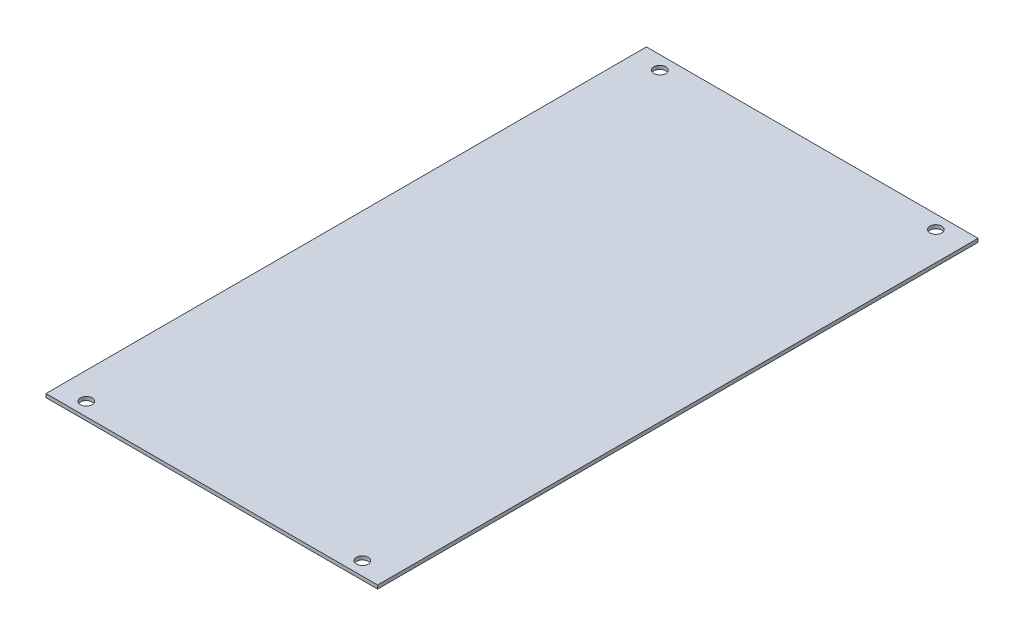
ISO-10303-21;
HEADER;
FILE_DESCRIPTION(('STEP AP214'),'2;1');
FILE_NAME('part.step','',(''),(''),'','','');
FILE_SCHEMA(('AUTOMOTIVE_DESIGN { 1 0 10303 214 1 1 1 1 }'));
ENDSEC;
DATA;
#1=APPLICATION_CONTEXT('core data for automotive mechanical design processes');
#2=APPLICATION_PROTOCOL_DEFINITION('international standard','automotive_design',2000,#1);
#3=PRODUCT_CONTEXT('',#1,'mechanical');
#4=PRODUCT('Part','Part','',(#3));
#5=PRODUCT_RELATED_PRODUCT_CATEGORY('part','',(#4));
#6=PRODUCT_DEFINITION_FORMATION('','',#4);
#7=PRODUCT_DEFINITION_CONTEXT('part definition',#1,'design');
#8=PRODUCT_DEFINITION('design','',#6,#7);
#9=PRODUCT_DEFINITION_SHAPE('','',#8);
#10=(LENGTH_UNIT() NAMED_UNIT(*) SI_UNIT(.MILLI.,.METRE.));
#11=(NAMED_UNIT(*) PLANE_ANGLE_UNIT() SI_UNIT($,.RADIAN.));
#12=(NAMED_UNIT(*) SI_UNIT($,.STERADIAN.) SOLID_ANGLE_UNIT());
#13=UNCERTAINTY_MEASURE_WITH_UNIT(LENGTH_MEASURE(1.E-05),#10,'distance_accuracy_value','');
#14=(GEOMETRIC_REPRESENTATION_CONTEXT(3) GLOBAL_UNCERTAINTY_ASSIGNED_CONTEXT((#13)) GLOBAL_UNIT_ASSIGNED_CONTEXT((#10,
#11,#12)) REPRESENTATION_CONTEXT('',''));
#15=CARTESIAN_POINT('',(0.,0.,0.));
#16=DIRECTION('',(0.,0.,1.));
#17=DIRECTION('',(1.,0.,0.));
#18=AXIS2_PLACEMENT_3D('',#15,#16,#17);
#19=CARTESIAN_POINT('',(92.4999999999999,-2.,167.5));
#20=DIRECTION('',(0.,1.,0.));
#21=DIRECTION('',(0.,0.,1.));
#22=AXIS2_PLACEMENT_3D('',#19,#20,#21);
#23=PLANE('',#22);
#24=CARTESIAN_POINT('',(76.4999999999999,-2.,160.));
#25=DIRECTION('',(0.,-1.,0.));
#26=DIRECTION('',(0.,0.,-1.));
#27=AXIS2_PLACEMENT_3D('',#24,#25,#26);
#28=CIRCLE('',#27,3.29999999999998);
#29=CARTESIAN_POINT('',(76.4999999999999,-2.,156.7));
#30=VERTEX_POINT('',#29);
#31=EDGE_CURVE('E172',#30,#30,#28,.T.);
#32=ORIENTED_EDGE('',*,*,#31,.F.);
#33=EDGE_LOOP('',(#32));
#34=FACE_BOUND('',#33,.T.);
#35=CARTESIAN_POINT('',(-77.5000000000001,-2.,-160.));
#36=DIRECTION('',(0.,-1.,0.));
#37=DIRECTION('',(0.,0.,-1.));
#38=AXIS2_PLACEMENT_3D('',#35,#36,#37);
#39=CIRCLE('',#38,3.29999999999998);
#40=CARTESIAN_POINT('',(-77.5000000000001,-2.,-163.3));
#41=VERTEX_POINT('',#40);
#42=EDGE_CURVE('E164',#41,#41,#39,.T.);
#43=ORIENTED_EDGE('',*,*,#42,.F.);
#44=EDGE_LOOP('',(#43));
#45=FACE_BOUND('',#44,.T.);
#46=CARTESIAN_POINT('',(76.4999999999999,-2.,-160.));
#47=DIRECTION('',(0.,-1.,0.));
#48=DIRECTION('',(0.,0.,-1.));
#49=AXIS2_PLACEMENT_3D('',#46,#47,#48);
#50=CIRCLE('',#49,3.29999999999998);
#51=CARTESIAN_POINT('',(76.4999999999999,-2.,-163.3));
#52=VERTEX_POINT('',#51);
#53=EDGE_CURVE('E159',#52,#52,#50,.T.);
#54=ORIENTED_EDGE('',*,*,#53,.F.);
#55=EDGE_LOOP('',(#54));
#56=FACE_BOUND('',#55,.T.);
#57=DIRECTION('',(0.,0.,-1.));
#58=VECTOR('',#57,1.);
#59=CARTESIAN_POINT('',(92.4999999999999,-2.,-167.5));
#60=LINE('',#59,#58);
#61=CARTESIAN_POINT('',(92.4999999999999,-2.,167.5));
#62=VERTEX_POINT('',#61);
#63=CARTESIAN_POINT('',(92.4999999999999,-2.,-167.5));
#64=VERTEX_POINT('',#63);
#65=EDGE_CURVE('E100',#62,#64,#60,.T.);
#66=ORIENTED_EDGE('',*,*,#65,.F.);
#67=DIRECTION('',(1.,0.,0.));
#68=VECTOR('',#67,1.);
#69=CARTESIAN_POINT('',(-92.5,-2.,167.5));
#70=LINE('',#69,#68);
#71=CARTESIAN_POINT('',(-92.5,-2.,167.5));
#72=VERTEX_POINT('',#71);
#73=EDGE_CURVE('E97',#72,#62,#70,.T.);
#74=ORIENTED_EDGE('',*,*,#73,.F.);
#75=DIRECTION('',(0.,0.,1.));
#76=VECTOR('',#75,1.);
#77=CARTESIAN_POINT('',(-92.5000000000001,-2.,-167.5));
#78=LINE('',#77,#76);
#79=CARTESIAN_POINT('',(-92.5000000000001,-2.,-167.5));
#80=VERTEX_POINT('',#79);
#81=EDGE_CURVE('E90',#80,#72,#78,.T.);
#82=ORIENTED_EDGE('',*,*,#81,.F.);
#83=DIRECTION('',(-1.,0.,0.));
#84=VECTOR('',#83,1.);
#85=CARTESIAN_POINT('',(-92.5000000000001,-2.,-167.5));
#86=LINE('',#85,#84);
#87=EDGE_CURVE('E96',#64,#80,#86,.T.);
#88=ORIENTED_EDGE('',*,*,#87,.F.);
#89=EDGE_LOOP('',(#66,#74,#82,#88));
#90=FACE_BOUND('',#89,.T.);
#91=CARTESIAN_POINT('',(-77.5000000000001,-2.,160.));
#92=DIRECTION('',(0.,-1.,0.));
#93=DIRECTION('',(0.,0.,-1.));
#94=AXIS2_PLACEMENT_3D('',#91,#92,#93);
#95=CIRCLE('',#94,3.29999999999998);
#96=CARTESIAN_POINT('',(-77.5000000000001,-2.,156.7));
#97=VERTEX_POINT('',#96);
#98=EDGE_CURVE('E168',#97,#97,#95,.T.);
#99=ORIENTED_EDGE('',*,*,#98,.F.);
#100=EDGE_LOOP('',(#99));
#101=FACE_BOUND('',#100,.T.);
#102=ADVANCED_FACE('F41',(#34,#45,#56,#90,#101),#23,.F.);
#103=CARTESIAN_POINT('',(92.4999999999999,-2.,-167.5));
#104=DIRECTION('',(1.,0.,0.));
#105=DIRECTION('',(0.,0.,-1.));
#106=AXIS2_PLACEMENT_3D('',#103,#104,#105);
#107=PLANE('',#106);
#108=DIRECTION('',(0.,0.,-1.));
#109=VECTOR('',#108,1.);
#110=CARTESIAN_POINT('',(92.4999999999999,0.,-167.5));
#111=LINE('',#110,#109);
#112=CARTESIAN_POINT('',(92.4999999999999,0.,167.5));
#113=VERTEX_POINT('',#112);
#114=CARTESIAN_POINT('',(92.4999999999999,0.,-167.5));
#115=VERTEX_POINT('',#114);
#116=EDGE_CURVE('E107',#113,#115,#111,.T.);
#117=ORIENTED_EDGE('',*,*,#116,.F.);
#118=DIRECTION('',(0.,1.,0.));
#119=VECTOR('',#118,1.);
#120=CARTESIAN_POINT('',(92.4999999999999,-2.,167.5));
#121=LINE('',#120,#119);
#122=EDGE_CURVE('E11',#62,#113,#121,.T.);
#123=ORIENTED_EDGE('',*,*,#122,.F.);
#124=ORIENTED_EDGE('',*,*,#65,.T.);
#125=DIRECTION('',(0.,1.,0.));
#126=VECTOR('',#125,1.);
#127=CARTESIAN_POINT('',(92.4999999999999,-2.,-167.5));
#128=LINE('',#127,#126);
#129=EDGE_CURVE('E45',#64,#115,#128,.T.);
#130=ORIENTED_EDGE('',*,*,#129,.T.);
#131=EDGE_LOOP('',(#117,#123,#124,#130));
#132=FACE_BOUND('',#131,.T.);
#133=ADVANCED_FACE('F43',(#132),#107,.T.);
#134=CARTESIAN_POINT('',(-92.5,-2.,167.5));
#135=DIRECTION('',(0.,0.,1.));
#136=DIRECTION('',(1.,0.,0.));
#137=AXIS2_PLACEMENT_3D('',#134,#135,#136);
#138=PLANE('',#137);
#139=DIRECTION('',(1.,0.,0.));
#140=VECTOR('',#139,1.);
#141=CARTESIAN_POINT('',(-92.5,0.,167.5));
#142=LINE('',#141,#140);
#143=CARTESIAN_POINT('',(-92.5,0.,167.5));
#144=VERTEX_POINT('',#143);
#145=EDGE_CURVE('E102',#144,#113,#142,.T.);
#146=ORIENTED_EDGE('',*,*,#145,.F.);
#147=DIRECTION('',(0.,1.,0.));
#148=VECTOR('',#147,1.);
#149=CARTESIAN_POINT('',(-92.5,-2.,167.5));
#150=LINE('',#149,#148);
#151=EDGE_CURVE('E51',#72,#144,#150,.T.);
#152=ORIENTED_EDGE('',*,*,#151,.F.);
#153=ORIENTED_EDGE('',*,*,#73,.T.);
#154=ORIENTED_EDGE('',*,*,#122,.T.);
#155=EDGE_LOOP('',(#146,#152,#153,#154));
#156=FACE_BOUND('',#155,.T.);
#157=ADVANCED_FACE('F118',(#156),#138,.T.);
#158=CARTESIAN_POINT('',(-92.5000000000001,-2.,-167.5));
#159=DIRECTION('',(-1.,0.,0.));
#160=DIRECTION('',(0.,0.,1.));
#161=AXIS2_PLACEMENT_3D('',#158,#159,#160);
#162=PLANE('',#161);
#163=DIRECTION('',(0.,0.,1.));
#164=VECTOR('',#163,1.);
#165=CARTESIAN_POINT('',(-92.5000000000001,0.,-167.5));
#166=LINE('',#165,#164);
#167=CARTESIAN_POINT('',(-92.5000000000001,0.,-167.5));
#168=VERTEX_POINT('',#167);
#169=EDGE_CURVE('E92',#168,#144,#166,.T.);
#170=ORIENTED_EDGE('',*,*,#169,.F.);
#171=DIRECTION('',(0.,1.,0.));
#172=VECTOR('',#171,1.);
#173=CARTESIAN_POINT('',(-92.5000000000001,-2.,-167.5));
#174=LINE('',#173,#172);
#175=EDGE_CURVE('E87',#80,#168,#174,.T.);
#176=ORIENTED_EDGE('',*,*,#175,.F.);
#177=ORIENTED_EDGE('',*,*,#81,.T.);
#178=ORIENTED_EDGE('',*,*,#151,.T.);
#179=EDGE_LOOP('',(#170,#176,#177,#178));
#180=FACE_BOUND('',#179,.T.);
#181=ADVANCED_FACE('F89',(#180),#162,.T.);
#182=CARTESIAN_POINT('',(-92.5000000000001,-2.,-167.5));
#183=DIRECTION('',(0.,0.,-1.));
#184=DIRECTION('',(-1.,0.,0.));
#185=AXIS2_PLACEMENT_3D('',#182,#183,#184);
#186=PLANE('',#185);
#187=DIRECTION('',(-1.,0.,0.));
#188=VECTOR('',#187,1.);
#189=CARTESIAN_POINT('',(-92.5000000000001,0.,-167.5));
#190=LINE('',#189,#188);
#191=EDGE_CURVE('E110',#115,#168,#190,.T.);
#192=ORIENTED_EDGE('',*,*,#191,.F.);
#193=ORIENTED_EDGE('',*,*,#129,.F.);
#194=ORIENTED_EDGE('',*,*,#87,.T.);
#195=ORIENTED_EDGE('',*,*,#175,.T.);
#196=EDGE_LOOP('',(#192,#193,#194,#195));
#197=FACE_BOUND('',#196,.T.);
#198=ADVANCED_FACE('F99',(#197),#186,.T.);
#199=CARTESIAN_POINT('',(92.4999999999999,0.,167.5));
#200=DIRECTION('',(0.,1.,0.));
#201=DIRECTION('',(0.,0.,1.));
#202=AXIS2_PLACEMENT_3D('',#199,#200,#201);
#203=PLANE('',#202);
#204=CARTESIAN_POINT('',(76.4999999999999,0.,160.));
#205=DIRECTION('',(0.,-1.,0.));
#206=DIRECTION('',(0.,0.,-1.));
#207=AXIS2_PLACEMENT_3D('',#204,#205,#206);
#208=CIRCLE('',#207,3.3);
#209=CARTESIAN_POINT('',(76.4999999999999,0.,156.7));
#210=VERTEX_POINT('',#209);
#211=EDGE_CURVE('E148',#210,#210,#208,.T.);
#212=ORIENTED_EDGE('',*,*,#211,.T.);
#213=EDGE_LOOP('',(#212));
#214=FACE_BOUND('',#213,.T.);
#215=CARTESIAN_POINT('',(-77.5000000000001,0.,160.));
#216=DIRECTION('',(0.,-1.,0.));
#217=DIRECTION('',(0.,0.,-1.));
#218=AXIS2_PLACEMENT_3D('',#215,#216,#217);
#219=CIRCLE('',#218,3.3);
#220=CARTESIAN_POINT('',(-77.5000000000001,0.,156.7));
#221=VERTEX_POINT('',#220);
#222=EDGE_CURVE('E152',#221,#221,#219,.T.);
#223=ORIENTED_EDGE('',*,*,#222,.T.);
#224=EDGE_LOOP('',(#223));
#225=FACE_BOUND('',#224,.T.);
#226=CARTESIAN_POINT('',(-77.5000000000001,0.,-160.));
#227=DIRECTION('',(0.,-1.,0.));
#228=DIRECTION('',(0.,0.,-1.));
#229=AXIS2_PLACEMENT_3D('',#226,#227,#228);
#230=CIRCLE('',#229,3.3);
#231=CARTESIAN_POINT('',(-77.5000000000001,0.,-163.3));
#232=VERTEX_POINT('',#231);
#233=EDGE_CURVE('E156',#232,#232,#230,.T.);
#234=ORIENTED_EDGE('',*,*,#233,.T.);
#235=EDGE_LOOP('',(#234));
#236=FACE_BOUND('',#235,.T.);
#237=CARTESIAN_POINT('',(76.4999999999999,0.,-160.));
#238=DIRECTION('',(0.,-1.,0.));
#239=DIRECTION('',(0.,0.,-1.));
#240=AXIS2_PLACEMENT_3D('',#237,#238,#239);
#241=CIRCLE('',#240,3.3);
#242=CARTESIAN_POINT('',(76.4999999999999,0.,-163.3));
#243=VERTEX_POINT('',#242);
#244=EDGE_CURVE('E111',#243,#243,#241,.T.);
#245=ORIENTED_EDGE('',*,*,#244,.T.);
#246=EDGE_LOOP('',(#245));
#247=FACE_BOUND('',#246,.T.);
#248=ORIENTED_EDGE('',*,*,#116,.T.);
#249=ORIENTED_EDGE('',*,*,#191,.T.);
#250=ORIENTED_EDGE('',*,*,#169,.T.);
#251=ORIENTED_EDGE('',*,*,#145,.T.);
#252=EDGE_LOOP('',(#248,#249,#250,#251));
#253=FACE_BOUND('',#252,.T.);
#254=ADVANCED_FACE('F117',(#214,#225,#236,#247,#253),#203,.T.);
#255=CARTESIAN_POINT('',(76.4999999999999,-2.,-160.));
#256=DIRECTION('',(0.,-1.,0.));
#257=DIRECTION('',(0.,0.,-1.));
#258=AXIS2_PLACEMENT_3D('',#255,#256,#257);
#259=CYLINDRICAL_SURFACE('',#258,3.29999999999999);
#260=ORIENTED_EDGE('',*,*,#244,.F.);
#261=EDGE_LOOP('',(#260));
#262=FACE_BOUND('',#261,.T.);
#263=ORIENTED_EDGE('',*,*,#53,.T.);
#264=EDGE_LOOP('',(#263));
#265=FACE_BOUND('',#264,.T.);
#266=ADVANCED_FACE('F135',(#262,#265),#259,.F.);
#267=CARTESIAN_POINT('',(-77.5000000000001,-2.,-160.));
#268=DIRECTION('',(0.,-1.,0.));
#269=DIRECTION('',(0.,0.,-1.));
#270=AXIS2_PLACEMENT_3D('',#267,#268,#269);
#271=CYLINDRICAL_SURFACE('',#270,3.29999999999999);
#272=ORIENTED_EDGE('',*,*,#233,.F.);
#273=EDGE_LOOP('',(#272));
#274=FACE_BOUND('',#273,.T.);
#275=ORIENTED_EDGE('',*,*,#42,.T.);
#276=EDGE_LOOP('',(#275));
#277=FACE_BOUND('',#276,.T.);
#278=ADVANCED_FACE('F143',(#274,#277),#271,.F.);
#279=CARTESIAN_POINT('',(-77.5000000000001,-2.,160.));
#280=DIRECTION('',(0.,-1.,0.));
#281=DIRECTION('',(0.,0.,-1.));
#282=AXIS2_PLACEMENT_3D('',#279,#280,#281);
#283=CYLINDRICAL_SURFACE('',#282,3.29999999999999);
#284=ORIENTED_EDGE('',*,*,#222,.F.);
#285=EDGE_LOOP('',(#284));
#286=FACE_BOUND('',#285,.T.);
#287=ORIENTED_EDGE('',*,*,#98,.T.);
#288=EDGE_LOOP('',(#287));
#289=FACE_BOUND('',#288,.T.);
#290=ADVANCED_FACE('F177',(#286,#289),#283,.F.);
#291=CARTESIAN_POINT('',(76.4999999999999,-2.,160.));
#292=DIRECTION('',(0.,-1.,0.));
#293=DIRECTION('',(0.,0.,-1.));
#294=AXIS2_PLACEMENT_3D('',#291,#292,#293);
#295=CYLINDRICAL_SURFACE('',#294,3.29999999999999);
#296=ORIENTED_EDGE('',*,*,#211,.F.);
#297=EDGE_LOOP('',(#296));
#298=FACE_BOUND('',#297,.T.);
#299=ORIENTED_EDGE('',*,*,#31,.T.);
#300=EDGE_LOOP('',(#299));
#301=FACE_BOUND('',#300,.T.);
#302=ADVANCED_FACE('F175',(#298,#301),#295,.F.);
#303=CLOSED_SHELL('',(#102,#133,#157,#181,#198,#254,#266,#278,#290,#302));
#304=MANIFOLD_SOLID_BREP('B2',#303);
#305=ADVANCED_BREP_SHAPE_REPRESENTATION('',(#18,#304),#14);
#306=SHAPE_DEFINITION_REPRESENTATION(#9,#305);
ENDSEC;
END-ISO-10303-21;
